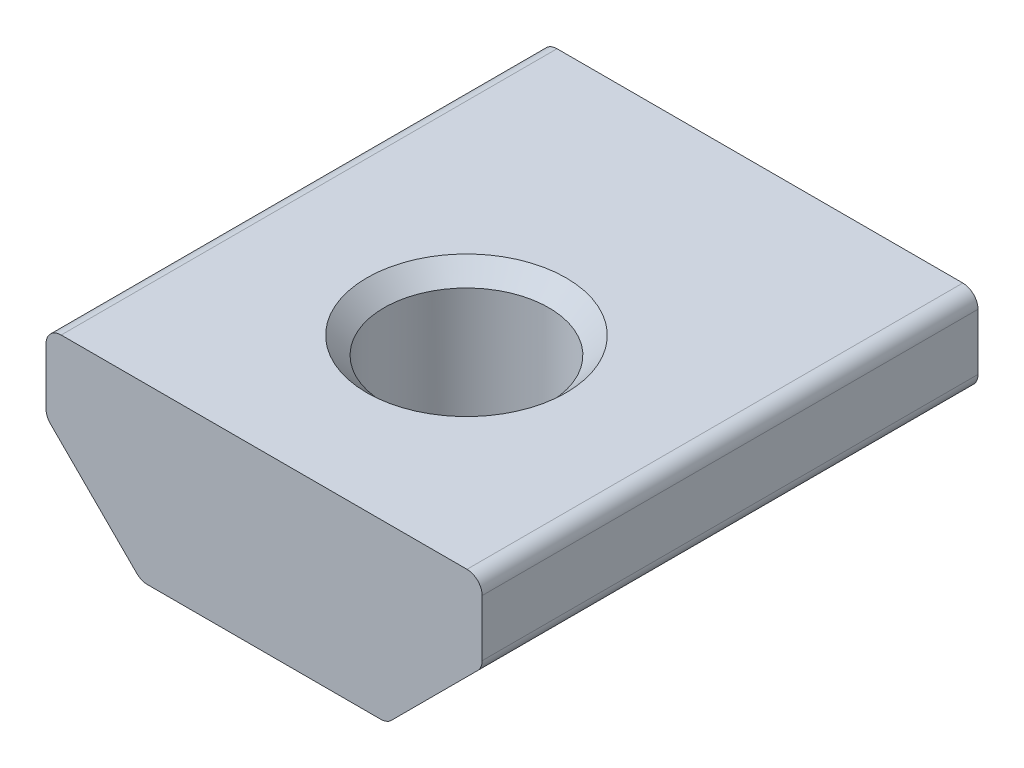
ISO-10303-21;
HEADER;
FILE_DESCRIPTION(('STEP AP214'),'2;1');
FILE_NAME('part.step','',(''),(''),'','','');
FILE_SCHEMA(('AUTOMOTIVE_DESIGN { 1 0 10303 214 1 1 1 1 }'));
ENDSEC;
DATA;
#1=APPLICATION_CONTEXT('core data for automotive mechanical design processes');
#2=APPLICATION_PROTOCOL_DEFINITION('international standard','automotive_design',2000,#1);
#3=PRODUCT_CONTEXT('',#1,'mechanical');
#4=PRODUCT('Part','Part','',(#3));
#5=PRODUCT_RELATED_PRODUCT_CATEGORY('part','',(#4));
#6=PRODUCT_DEFINITION_FORMATION('','',#4);
#7=PRODUCT_DEFINITION_CONTEXT('part definition',#1,'design');
#8=PRODUCT_DEFINITION('design','',#6,#7);
#9=PRODUCT_DEFINITION_SHAPE('','',#8);
#10=(LENGTH_UNIT() NAMED_UNIT(*) SI_UNIT(.MILLI.,.METRE.));
#11=(NAMED_UNIT(*) PLANE_ANGLE_UNIT() SI_UNIT($,.RADIAN.));
#12=(NAMED_UNIT(*) SI_UNIT($,.STERADIAN.) SOLID_ANGLE_UNIT());
#13=UNCERTAINTY_MEASURE_WITH_UNIT(LENGTH_MEASURE(1.E-05),#10,'distance_accuracy_value','');
#14=(GEOMETRIC_REPRESENTATION_CONTEXT(3) GLOBAL_UNCERTAINTY_ASSIGNED_CONTEXT((#13)) GLOBAL_UNIT_ASSIGNED_CONTEXT((#10,
#11,#12)) REPRESENTATION_CONTEXT('',''));
#15=CARTESIAN_POINT('',(0.,0.,0.));
#16=DIRECTION('',(0.,0.,1.));
#17=DIRECTION('',(1.,0.,0.));
#18=AXIS2_PLACEMENT_3D('',#15,#16,#17);
#19=CARTESIAN_POINT('',(5.4737,2.38887,-7.366));
#20=DIRECTION('',(1.,0.,0.));
#21=DIRECTION('',(0.,1.,0.));
#22=AXIS2_PLACEMENT_3D('',#19,#20,#21);
#23=PLANE('',#22);
#24=DIRECTION('',(0.,1.,0.));
#25=VECTOR('',#24,1.);
#26=CARTESIAN_POINT('',(5.4737,2.38887,-7.366));
#27=LINE('',#26,#25);
#28=CARTESIAN_POINT('',(5.4737,2.54668536726424,-7.366));
#29=VERTEX_POINT('',#28);
#30=CARTESIAN_POINT('',(5.4737,3.96239999999977,-7.366));
#31=VERTEX_POINT('',#30);
#32=EDGE_CURVE('E207',#29,#31,#27,.T.);
#33=ORIENTED_EDGE('',*,*,#32,.T.);
#34=DIRECTION('',(0.,0.,1.));
#35=VECTOR('',#34,1.);
#36=CARTESIAN_POINT('',(5.4737,3.96239999999977,-7.366));
#37=LINE('',#36,#35);
#38=CARTESIAN_POINT('',(5.4737,3.96239999999977,5.08));
#39=VERTEX_POINT('',#38);
#40=EDGE_CURVE('E189',#31,#39,#37,.T.);
#41=ORIENTED_EDGE('',*,*,#40,.T.);
#42=DIRECTION('',(0.,1.,0.));
#43=VECTOR('',#42,1.);
#44=CARTESIAN_POINT('',(5.4737,2.38887,5.08));
#45=LINE('',#44,#43);
#46=CARTESIAN_POINT('',(5.4737,2.54668536726424,5.08));
#47=VERTEX_POINT('',#46);
#48=EDGE_CURVE('E255',#47,#39,#45,.T.);
#49=ORIENTED_EDGE('',*,*,#48,.F.);
#50=DIRECTION('',(0.,0.,1.));
#51=VECTOR('',#50,1.);
#52=CARTESIAN_POINT('',(5.4737,2.54668536726424,-7.366));
#53=LINE('',#52,#51);
#54=EDGE_CURVE('E187',#47,#29,#53,.F.);
#55=ORIENTED_EDGE('',*,*,#54,.T.);
#56=EDGE_LOOP('',(#33,#41,#49,#55));
#57=FACE_BOUND('',#56,.T.);
#58=ADVANCED_FACE('F32',(#57),#23,.T.);
#59=CARTESIAN_POINT('',(3.08482999999997,0.,-7.366));
#60=DIRECTION('',(0.707106781186543,-0.707106781186552,0.));
#61=DIRECTION('',(0.707106781186552,0.707106781186543,0.));
#62=AXIS2_PLACEMENT_3D('',#59,#60,#61);
#63=PLANE('',#62);
#64=DIRECTION('',(0.707106781186552,0.707106781186543,0.));
#65=VECTOR('',#64,1.);
#66=CARTESIAN_POINT('',(3.08482999999997,0.,5.08));
#67=LINE('',#66,#65);
#68=CARTESIAN_POINT('',(3.19642231636797,0.11159231636799,5.08));
#69=VERTEX_POINT('',#68);
#70=CARTESIAN_POINT('',(5.36210768363201,2.277277683632,5.08));
#71=VERTEX_POINT('',#70);
#72=EDGE_CURVE('E198',#69,#71,#67,.T.);
#73=ORIENTED_EDGE('',*,*,#72,.F.);
#74=DIRECTION('',(0.,0.,1.));
#75=VECTOR('',#74,1.);
#76=CARTESIAN_POINT('',(3.19642231636797,0.11159231636799,-7.366));
#77=LINE('',#76,#75);
#78=CARTESIAN_POINT('',(3.19642231636797,0.11159231636799,-7.366));
#79=VERTEX_POINT('',#78);
#80=EDGE_CURVE('E11',#69,#79,#77,.F.);
#81=ORIENTED_EDGE('',*,*,#80,.T.);
#82=DIRECTION('',(0.707106781186552,0.707106781186543,0.));
#83=VECTOR('',#82,1.);
#84=CARTESIAN_POINT('',(3.08482999999997,0.,-7.366));
#85=LINE('',#84,#83);
#86=CARTESIAN_POINT('',(5.36210768363201,2.277277683632,-7.366));
#87=VERTEX_POINT('',#86);
#88=EDGE_CURVE('E201',#79,#87,#85,.T.);
#89=ORIENTED_EDGE('',*,*,#88,.T.);
#90=DIRECTION('',(0.,0.,1.));
#91=VECTOR('',#90,1.);
#92=CARTESIAN_POINT('',(5.36210768363201,2.277277683632,-7.366));
#93=LINE('',#92,#91);
#94=EDGE_CURVE('E40',#87,#71,#93,.T.);
#95=ORIENTED_EDGE('',*,*,#94,.T.);
#96=EDGE_LOOP('',(#73,#81,#89,#95));
#97=FACE_BOUND('',#96,.T.);
#98=ADVANCED_FACE('F197',(#97),#63,.T.);
#99=CARTESIAN_POINT('',(-3.08482999999997,0.,-7.366));
#100=DIRECTION('',(0.,-1.,0.));
#101=DIRECTION('',(1.,0.,0.));
#102=AXIS2_PLACEMENT_3D('',#99,#100,#101);
#103=PLANE('',#102);
#104=CARTESIAN_POINT('',(0.,0.,0.));
#105=DIRECTION('',(0.,-1.,0.));
#106=DIRECTION('',(1.,0.,0.));
#107=AXIS2_PLACEMENT_3D('',#104,#105,#106);
#108=CIRCLE('',#107,2.49999999999999);
#109=CARTESIAN_POINT('',(2.49999999999999,0.,0.));
#110=VERTEX_POINT('',#109);
#111=EDGE_CURVE('E214',#110,#110,#108,.F.);
#112=ORIENTED_EDGE('',*,*,#111,.T.);
#113=EDGE_LOOP('',(#112));
#114=FACE_BOUND('',#113,.T.);
#115=DIRECTION('',(1.,0.,0.));
#116=VECTOR('',#115,1.);
#117=CARTESIAN_POINT('',(-3.08482999999997,0.,5.08));
#118=LINE('',#117,#116);
#119=CARTESIAN_POINT('',(-2.92701463273573,0.,5.08));
#120=VERTEX_POINT('',#119);
#121=CARTESIAN_POINT('',(2.92701463273573,0.,5.08));
#122=VERTEX_POINT('',#121);
#123=EDGE_CURVE('E143',#120,#122,#118,.T.);
#124=ORIENTED_EDGE('',*,*,#123,.F.);
#125=DIRECTION('',(0.,0.,1.));
#126=VECTOR('',#125,1.);
#127=CARTESIAN_POINT('',(-2.92701463273573,0.,-7.366));
#128=LINE('',#127,#126);
#129=CARTESIAN_POINT('',(-2.92701463273573,0.,-7.366));
#130=VERTEX_POINT('',#129);
#131=EDGE_CURVE('E167',#120,#130,#128,.F.);
#132=ORIENTED_EDGE('',*,*,#131,.T.);
#133=DIRECTION('',(1.,0.,0.));
#134=VECTOR('',#133,1.);
#135=CARTESIAN_POINT('',(-3.08482999999997,0.,-7.366));
#136=LINE('',#135,#134);
#137=CARTESIAN_POINT('',(2.92701463273573,0.,-7.366));
#138=VERTEX_POINT('',#137);
#139=EDGE_CURVE('E246',#130,#138,#136,.T.);
#140=ORIENTED_EDGE('',*,*,#139,.T.);
#141=DIRECTION('',(0.,0.,1.));
#142=VECTOR('',#141,1.);
#143=CARTESIAN_POINT('',(2.92701463273573,0.,-7.366));
#144=LINE('',#143,#142);
#145=EDGE_CURVE('E164',#138,#122,#144,.T.);
#146=ORIENTED_EDGE('',*,*,#145,.T.);
#147=EDGE_LOOP('',(#124,#132,#140,#146));
#148=FACE_BOUND('',#147,.T.);
#149=ADVANCED_FACE('F232',(#114,#148),#103,.T.);
#150=CARTESIAN_POINT('',(-5.4737,2.38887,-7.366));
#151=DIRECTION('',(-0.707106781186544,-0.707106781186551,0.));
#152=DIRECTION('',(0.707106781186551,-0.707106781186544,0.));
#153=AXIS2_PLACEMENT_3D('',#150,#151,#152);
#154=PLANE('',#153);
#155=DIRECTION('',(0.707106781186551,-0.707106781186544,0.));
#156=VECTOR('',#155,1.);
#157=CARTESIAN_POINT('',(-5.4737,2.38887,-7.366));
#158=LINE('',#157,#156);
#159=CARTESIAN_POINT('',(-5.36210768363201,2.27727768363201,-7.366));
#160=VERTEX_POINT('',#159);
#161=CARTESIAN_POINT('',(-3.19642231636796,0.11159231636799,-7.366));
#162=VERTEX_POINT('',#161);
#163=EDGE_CURVE('E245',#160,#162,#158,.T.);
#164=ORIENTED_EDGE('',*,*,#163,.T.);
#165=DIRECTION('',(0.,0.,1.));
#166=VECTOR('',#165,1.);
#167=CARTESIAN_POINT('',(-3.19642231636796,0.111592316367991,-7.366));
#168=LINE('',#167,#166);
#169=CARTESIAN_POINT('',(-3.19642231636796,0.11159231636799,5.08));
#170=VERTEX_POINT('',#169);
#171=EDGE_CURVE('E142',#162,#170,#168,.T.);
#172=ORIENTED_EDGE('',*,*,#171,.T.);
#173=DIRECTION('',(0.707106781186551,-0.707106781186544,0.));
#174=VECTOR('',#173,1.);
#175=CARTESIAN_POINT('',(-5.4737,2.38887,5.08));
#176=LINE('',#175,#174);
#177=CARTESIAN_POINT('',(-5.36210768363201,2.27727768363201,5.08));
#178=VERTEX_POINT('',#177);
#179=EDGE_CURVE('E125',#178,#170,#176,.T.);
#180=ORIENTED_EDGE('',*,*,#179,.F.);
#181=DIRECTION('',(0.,0.,1.));
#182=VECTOR('',#181,1.);
#183=CARTESIAN_POINT('',(-5.36210768363201,2.27727768363201,-7.366));
#184=LINE('',#183,#182);
#185=EDGE_CURVE('E139',#178,#160,#184,.F.);
#186=ORIENTED_EDGE('',*,*,#185,.T.);
#187=EDGE_LOOP('',(#164,#172,#180,#186));
#188=FACE_BOUND('',#187,.T.);
#189=ADVANCED_FACE('F138',(#188),#154,.T.);
#190=CARTESIAN_POINT('',(-5.4737,4.3434,-7.366));
#191=DIRECTION('',(-1.,0.,0.));
#192=DIRECTION('',(0.,-1.,0.));
#193=AXIS2_PLACEMENT_3D('',#190,#191,#192);
#194=PLANE('',#193);
#195=DIRECTION('',(0.,-1.,0.));
#196=VECTOR('',#195,1.);
#197=CARTESIAN_POINT('',(-5.4737,4.3434,5.08));
#198=LINE('',#197,#196);
#199=CARTESIAN_POINT('',(-5.4737,3.96239999999977,5.08));
#200=VERTEX_POINT('',#199);
#201=CARTESIAN_POINT('',(-5.4737,2.54668536726425,5.08));
#202=VERTEX_POINT('',#201);
#203=EDGE_CURVE('E127',#200,#202,#198,.T.);
#204=ORIENTED_EDGE('',*,*,#203,.F.);
#205=DIRECTION('',(0.,0.,1.));
#206=VECTOR('',#205,1.);
#207=CARTESIAN_POINT('',(-5.4737,3.96239999999977,-7.366));
#208=LINE('',#207,#206);
#209=CARTESIAN_POINT('',(-5.4737,3.96239999999977,-7.366));
#210=VERTEX_POINT('',#209);
#211=EDGE_CURVE('E185',#200,#210,#208,.F.);
#212=ORIENTED_EDGE('',*,*,#211,.T.);
#213=DIRECTION('',(0.,-1.,0.));
#214=VECTOR('',#213,1.);
#215=CARTESIAN_POINT('',(-5.4737,4.3434,-7.366));
#216=LINE('',#215,#214);
#217=CARTESIAN_POINT('',(-5.4737,2.54668536726425,-7.366));
#218=VERTEX_POINT('',#217);
#219=EDGE_CURVE('E247',#210,#218,#216,.T.);
#220=ORIENTED_EDGE('',*,*,#219,.T.);
#221=DIRECTION('',(0.,0.,1.));
#222=VECTOR('',#221,1.);
#223=CARTESIAN_POINT('',(-5.4737,2.54668536726425,-7.366));
#224=LINE('',#223,#222);
#225=EDGE_CURVE('E183',#218,#202,#224,.T.);
#226=ORIENTED_EDGE('',*,*,#225,.T.);
#227=EDGE_LOOP('',(#204,#212,#220,#226));
#228=FACE_BOUND('',#227,.T.);
#229=ADVANCED_FACE('F367',(#228),#194,.T.);
#230=CARTESIAN_POINT('',(5.4737,4.3434,-7.366));
#231=DIRECTION('',(0.,1.,0.));
#232=DIRECTION('',(0.,0.,1.));
#233=AXIS2_PLACEMENT_3D('',#230,#231,#232);
#234=PLANE('',#233);
#235=CARTESIAN_POINT('',(0.,4.3434,0.));
#236=DIRECTION('',(0.,1.,0.));
#237=DIRECTION('',(0.,0.,1.));
#238=AXIS2_PLACEMENT_3D('',#235,#236,#237);
#239=CIRCLE('',#238,2.49999999999998);
#240=CARTESIAN_POINT('',(0.,4.3434,2.49999999999998));
#241=VERTEX_POINT('',#240);
#242=EDGE_CURVE('E148',#241,#241,#239,.F.);
#243=ORIENTED_EDGE('',*,*,#242,.T.);
#244=EDGE_LOOP('',(#243));
#245=FACE_BOUND('',#244,.T.);
#246=DIRECTION('',(-1.,0.,0.));
#247=VECTOR('',#246,1.);
#248=CARTESIAN_POINT('',(5.4737,4.3434,-7.366));
#249=LINE('',#248,#247);
#250=CARTESIAN_POINT('',(5.09269999999978,4.3434,-7.366));
#251=VERTEX_POINT('',#250);
#252=CARTESIAN_POINT('',(-5.09269999999977,4.3434,-7.366));
#253=VERTEX_POINT('',#252);
#254=EDGE_CURVE('E210',#251,#253,#249,.T.);
#255=ORIENTED_EDGE('',*,*,#254,.T.);
#256=DIRECTION('',(0.,0.,1.));
#257=VECTOR('',#256,1.);
#258=CARTESIAN_POINT('',(-5.09269999999977,4.3434,-7.366));
#259=LINE('',#258,#257);
#260=CARTESIAN_POINT('',(-5.09269999999977,4.3434,5.08));
#261=VERTEX_POINT('',#260);
#262=EDGE_CURVE('E180',#253,#261,#259,.T.);
#263=ORIENTED_EDGE('',*,*,#262,.T.);
#264=DIRECTION('',(-1.,0.,0.));
#265=VECTOR('',#264,1.);
#266=CARTESIAN_POINT('',(5.4737,4.3434,5.08));
#267=LINE('',#266,#265);
#268=CARTESIAN_POINT('',(5.09269999999978,4.3434,5.08));
#269=VERTEX_POINT('',#268);
#270=EDGE_CURVE('E257',#269,#261,#267,.T.);
#271=ORIENTED_EDGE('',*,*,#270,.F.);
#272=DIRECTION('',(0.,0.,1.));
#273=VECTOR('',#272,1.);
#274=CARTESIAN_POINT('',(5.09269999999978,4.3434,-7.366));
#275=LINE('',#274,#273);
#276=EDGE_CURVE('E54',#269,#251,#275,.F.);
#277=ORIENTED_EDGE('',*,*,#276,.T.);
#278=EDGE_LOOP('',(#255,#263,#271,#277));
#279=FACE_BOUND('',#278,.T.);
#280=ADVANCED_FACE('F260',(#245,#279),#234,.T.);
#281=CARTESIAN_POINT('',(0.,0.,-7.366));
#282=DIRECTION('',(0.,0.,1.));
#283=DIRECTION('',(1.,0.,0.));
#284=AXIS2_PLACEMENT_3D('',#281,#282,#283);
#285=PLANE('',#284);
#286=ORIENTED_EDGE('',*,*,#139,.F.);
#287=CARTESIAN_POINT('',(-2.92701463273573,0.381000000000227,-7.366));
#288=DIRECTION('',(0.,0.,1.));
#289=DIRECTION('',(1.,0.,0.));
#290=AXIS2_PLACEMENT_3D('',#287,#288,#289);
#291=CIRCLE('',#290,0.381000000000226);
#292=EDGE_CURVE('E177',#130,#162,#291,.F.);
#293=ORIENTED_EDGE('',*,*,#292,.T.);
#294=ORIENTED_EDGE('',*,*,#163,.F.);
#295=CARTESIAN_POINT('',(-5.09269999999977,2.54668536726425,-7.366));
#296=DIRECTION('',(0.,0.,1.));
#297=DIRECTION('',(1.,0.,0.));
#298=AXIS2_PLACEMENT_3D('',#295,#296,#297);
#299=CIRCLE('',#298,0.381000000000226);
#300=EDGE_CURVE('E147',#160,#218,#299,.F.);
#301=ORIENTED_EDGE('',*,*,#300,.T.);
#302=ORIENTED_EDGE('',*,*,#219,.F.);
#303=CARTESIAN_POINT('',(-5.09269999999977,3.96239999999977,-7.366));
#304=DIRECTION('',(0.,0.,1.));
#305=DIRECTION('',(1.,0.,0.));
#306=AXIS2_PLACEMENT_3D('',#303,#304,#305);
#307=CIRCLE('',#306,0.381000000000226);
#308=EDGE_CURVE('E47',#210,#253,#307,.F.);
#309=ORIENTED_EDGE('',*,*,#308,.T.);
#310=ORIENTED_EDGE('',*,*,#254,.F.);
#311=CARTESIAN_POINT('',(5.09269999999978,3.96239999999977,-7.366));
#312=DIRECTION('',(0.,0.,1.));
#313=DIRECTION('',(1.,0.,0.));
#314=AXIS2_PLACEMENT_3D('',#311,#312,#313);
#315=CIRCLE('',#314,0.381000000000226);
#316=EDGE_CURVE('E173',#251,#31,#315,.F.);
#317=ORIENTED_EDGE('',*,*,#316,.T.);
#318=ORIENTED_EDGE('',*,*,#32,.F.);
#319=CARTESIAN_POINT('',(5.09269999999977,2.54668536726424,-7.366));
#320=DIRECTION('',(0.,0.,1.));
#321=DIRECTION('',(1.,0.,0.));
#322=AXIS2_PLACEMENT_3D('',#319,#320,#321);
#323=CIRCLE('',#322,0.381000000000226);
#324=EDGE_CURVE('E169',#29,#87,#323,.F.);
#325=ORIENTED_EDGE('',*,*,#324,.T.);
#326=ORIENTED_EDGE('',*,*,#88,.F.);
#327=CARTESIAN_POINT('',(2.92701463273573,0.381000000000226,-7.366));
#328=DIRECTION('',(0.,0.,1.));
#329=DIRECTION('',(1.,0.,0.));
#330=AXIS2_PLACEMENT_3D('',#327,#328,#329);
#331=CIRCLE('',#330,0.381000000000226);
#332=EDGE_CURVE('E171',#79,#138,#331,.F.);
#333=ORIENTED_EDGE('',*,*,#332,.T.);
#334=EDGE_LOOP('',(#286,#293,#294,#301,#302,#309,#310,#317,#318,#325,#326,#333));
#335=FACE_BOUND('',#334,.T.);
#336=ADVANCED_FACE('F244',(#335),#285,.F.);
#337=CARTESIAN_POINT('',(0.,0.,5.08));
#338=DIRECTION('',(0.,0.,1.));
#339=DIRECTION('',(1.,0.,0.));
#340=AXIS2_PLACEMENT_3D('',#337,#338,#339);
#341=PLANE('',#340);
#342=ORIENTED_EDGE('',*,*,#179,.T.);
#343=CARTESIAN_POINT('',(-2.92701463273573,0.381000000000227,5.08));
#344=DIRECTION('',(0.,0.,1.));
#345=DIRECTION('',(1.,0.,0.));
#346=AXIS2_PLACEMENT_3D('',#343,#344,#345);
#347=CIRCLE('',#346,0.381000000000226);
#348=EDGE_CURVE('E162',#170,#120,#347,.T.);
#349=ORIENTED_EDGE('',*,*,#348,.T.);
#350=ORIENTED_EDGE('',*,*,#123,.T.);
#351=CARTESIAN_POINT('',(2.92701463273573,0.381000000000226,5.08));
#352=DIRECTION('',(0.,0.,1.));
#353=DIRECTION('',(1.,0.,0.));
#354=AXIS2_PLACEMENT_3D('',#351,#352,#353);
#355=CIRCLE('',#354,0.381000000000226);
#356=EDGE_CURVE('E158',#122,#69,#355,.T.);
#357=ORIENTED_EDGE('',*,*,#356,.T.);
#358=ORIENTED_EDGE('',*,*,#72,.T.);
#359=CARTESIAN_POINT('',(5.09269999999977,2.54668536726424,5.08));
#360=DIRECTION('',(0.,0.,1.));
#361=DIRECTION('',(1.,0.,0.));
#362=AXIS2_PLACEMENT_3D('',#359,#360,#361);
#363=CIRCLE('',#362,0.381000000000226);
#364=EDGE_CURVE('E150',#71,#47,#363,.T.);
#365=ORIENTED_EDGE('',*,*,#364,.T.);
#366=ORIENTED_EDGE('',*,*,#48,.T.);
#367=CARTESIAN_POINT('',(5.09269999999978,3.96239999999977,5.08));
#368=DIRECTION('',(0.,0.,1.));
#369=DIRECTION('',(1.,0.,0.));
#370=AXIS2_PLACEMENT_3D('',#367,#368,#369);
#371=CIRCLE('',#370,0.381000000000226);
#372=EDGE_CURVE('E133',#39,#269,#371,.T.);
#373=ORIENTED_EDGE('',*,*,#372,.T.);
#374=ORIENTED_EDGE('',*,*,#270,.T.);
#375=CARTESIAN_POINT('',(-5.09269999999977,3.96239999999977,5.08));
#376=DIRECTION('',(0.,0.,1.));
#377=DIRECTION('',(1.,0.,0.));
#378=AXIS2_PLACEMENT_3D('',#375,#376,#377);
#379=CIRCLE('',#378,0.381000000000226);
#380=EDGE_CURVE('E132',#261,#200,#379,.T.);
#381=ORIENTED_EDGE('',*,*,#380,.T.);
#382=ORIENTED_EDGE('',*,*,#203,.T.);
#383=CARTESIAN_POINT('',(-5.09269999999977,2.54668536726425,5.08));
#384=DIRECTION('',(0.,0.,1.));
#385=DIRECTION('',(1.,0.,0.));
#386=AXIS2_PLACEMENT_3D('',#383,#384,#385);
#387=CIRCLE('',#386,0.381000000000226);
#388=EDGE_CURVE('E122',#202,#178,#387,.T.);
#389=ORIENTED_EDGE('',*,*,#388,.T.);
#390=EDGE_LOOP('',(#342,#349,#350,#357,#358,#365,#366,#373,#374,#381,#382,#389));
#391=FACE_BOUND('',#390,.T.);
#392=ADVANCED_FACE('F124',(#391),#341,.T.);
#393=CARTESIAN_POINT('',(0.,4.3434,0.));
#394=DIRECTION('',(0.,1.,0.));
#395=DIRECTION('',(0.,0.,1.));
#396=AXIS2_PLACEMENT_3D('',#393,#394,#395);
#397=CYLINDRICAL_SURFACE('',#396,2.06699999999999);
#398=CARTESIAN_POINT('',(0.,0.433000000000005,0.));
#399=DIRECTION('',(0.,-1.,0.));
#400=DIRECTION('',(0.,0.,-1.));
#401=AXIS2_PLACEMENT_3D('',#398,#399,#400);
#402=CIRCLE('',#401,2.06699999999999);
#403=CARTESIAN_POINT('',(0.,0.433000000000005,-2.06699999999999));
#404=VERTEX_POINT('',#403);
#405=EDGE_CURVE('E153',#404,#404,#402,.T.);
#406=ORIENTED_EDGE('',*,*,#405,.T.);
#407=EDGE_LOOP('',(#406));
#408=FACE_BOUND('',#407,.T.);
#409=CARTESIAN_POINT('',(0.,3.91040000000001,0.));
#410=DIRECTION('',(0.,1.,0.));
#411=DIRECTION('',(0.,0.,1.));
#412=AXIS2_PLACEMENT_3D('',#409,#410,#411);
#413=CIRCLE('',#412,2.06699999999999);
#414=CARTESIAN_POINT('',(0.,3.91040000000001,2.06699999999999));
#415=VERTEX_POINT('',#414);
#416=EDGE_CURVE('E217',#415,#415,#413,.T.);
#417=ORIENTED_EDGE('',*,*,#416,.T.);
#418=EDGE_LOOP('',(#417));
#419=FACE_BOUND('',#418,.T.);
#420=ADVANCED_FACE('F222',(#408,#419),#397,.F.);
#421=CARTESIAN_POINT('',(0.,0.,0.));
#422=DIRECTION('',(0.,-1.,0.));
#423=DIRECTION('',(0.,0.,-1.));
#424=AXIS2_PLACEMENT_3D('',#421,#422,#423);
#425=CONICAL_SURFACE('',#424,2.49999999999999,0.785398163397446);
#426=ORIENTED_EDGE('',*,*,#405,.F.);
#427=EDGE_LOOP('',(#426));
#428=FACE_BOUND('',#427,.T.);
#429=ORIENTED_EDGE('',*,*,#111,.F.);
#430=EDGE_LOOP('',(#429));
#431=FACE_BOUND('',#430,.T.);
#432=ADVANCED_FACE('F225',(#428,#431),#425,.F.);
#433=CARTESIAN_POINT('',(0.,3.91040000000001,0.));
#434=DIRECTION('',(0.,1.,0.));
#435=DIRECTION('',(0.,0.,1.));
#436=AXIS2_PLACEMENT_3D('',#433,#434,#435);
#437=CONICAL_SURFACE('',#436,2.06699999999999,0.785398163397453);
#438=ORIENTED_EDGE('',*,*,#242,.F.);
#439=EDGE_LOOP('',(#438));
#440=FACE_BOUND('',#439,.T.);
#441=ORIENTED_EDGE('',*,*,#416,.F.);
#442=EDGE_LOOP('',(#441));
#443=FACE_BOUND('',#442,.T.);
#444=ADVANCED_FACE('F228',(#440,#443),#437,.F.);
#445=CARTESIAN_POINT('',(-2.92701463273573,0.381000000000227,-7.366));
#446=DIRECTION('',(0.,0.,1.));
#447=DIRECTION('',(1.,0.,0.));
#448=AXIS2_PLACEMENT_3D('',#445,#446,#447);
#449=CYLINDRICAL_SURFACE('',#448,0.381000000000226);
#450=ORIENTED_EDGE('',*,*,#292,.F.);
#451=ORIENTED_EDGE('',*,*,#131,.F.);
#452=ORIENTED_EDGE('',*,*,#348,.F.);
#453=ORIENTED_EDGE('',*,*,#171,.F.);
#454=EDGE_LOOP('',(#450,#451,#452,#453));
#455=FACE_BOUND('',#454,.T.);
#456=ADVANCED_FACE('F243',(#455),#449,.T.);
#457=CARTESIAN_POINT('',(-5.09269999999977,3.96239999999977,-7.366));
#458=DIRECTION('',(0.,0.,1.));
#459=DIRECTION('',(1.,0.,0.));
#460=AXIS2_PLACEMENT_3D('',#457,#458,#459);
#461=CYLINDRICAL_SURFACE('',#460,0.381000000000226);
#462=ORIENTED_EDGE('',*,*,#308,.F.);
#463=ORIENTED_EDGE('',*,*,#211,.F.);
#464=ORIENTED_EDGE('',*,*,#380,.F.);
#465=ORIENTED_EDGE('',*,*,#262,.F.);
#466=EDGE_LOOP('',(#462,#463,#464,#465));
#467=FACE_BOUND('',#466,.T.);
#468=ADVANCED_FACE('F292',(#467),#461,.T.);
#469=CARTESIAN_POINT('',(-5.09269999999977,2.54668536726425,-7.366));
#470=DIRECTION('',(0.,0.,1.));
#471=DIRECTION('',(1.,0.,0.));
#472=AXIS2_PLACEMENT_3D('',#469,#470,#471);
#473=CYLINDRICAL_SURFACE('',#472,0.381000000000226);
#474=ORIENTED_EDGE('',*,*,#300,.F.);
#475=ORIENTED_EDGE('',*,*,#185,.F.);
#476=ORIENTED_EDGE('',*,*,#388,.F.);
#477=ORIENTED_EDGE('',*,*,#225,.F.);
#478=EDGE_LOOP('',(#474,#475,#476,#477));
#479=FACE_BOUND('',#478,.T.);
#480=ADVANCED_FACE('F146',(#479),#473,.T.);
#481=CARTESIAN_POINT('',(5.09269999999978,3.96239999999977,-7.366));
#482=DIRECTION('',(0.,0.,1.));
#483=DIRECTION('',(1.,0.,0.));
#484=AXIS2_PLACEMENT_3D('',#481,#482,#483);
#485=CYLINDRICAL_SURFACE('',#484,0.381000000000226);
#486=ORIENTED_EDGE('',*,*,#316,.F.);
#487=ORIENTED_EDGE('',*,*,#276,.F.);
#488=ORIENTED_EDGE('',*,*,#372,.F.);
#489=ORIENTED_EDGE('',*,*,#40,.F.);
#490=EDGE_LOOP('',(#486,#487,#488,#489));
#491=FACE_BOUND('',#490,.T.);
#492=ADVANCED_FACE('F264',(#491),#485,.T.);
#493=CARTESIAN_POINT('',(2.92701463273573,0.381000000000226,-7.366));
#494=DIRECTION('',(0.,0.,1.));
#495=DIRECTION('',(1.,0.,0.));
#496=AXIS2_PLACEMENT_3D('',#493,#494,#495);
#497=CYLINDRICAL_SURFACE('',#496,0.381000000000226);
#498=ORIENTED_EDGE('',*,*,#332,.F.);
#499=ORIENTED_EDGE('',*,*,#80,.F.);
#500=ORIENTED_EDGE('',*,*,#356,.F.);
#501=ORIENTED_EDGE('',*,*,#145,.F.);
#502=EDGE_LOOP('',(#498,#499,#500,#501));
#503=FACE_BOUND('',#502,.T.);
#504=ADVANCED_FACE('F271',(#503),#497,.T.);
#505=CARTESIAN_POINT('',(5.09269999999977,2.54668536726424,-7.366));
#506=DIRECTION('',(0.,0.,1.));
#507=DIRECTION('',(1.,0.,0.));
#508=AXIS2_PLACEMENT_3D('',#505,#506,#507);
#509=CYLINDRICAL_SURFACE('',#508,0.381000000000226);
#510=ORIENTED_EDGE('',*,*,#324,.F.);
#511=ORIENTED_EDGE('',*,*,#54,.F.);
#512=ORIENTED_EDGE('',*,*,#364,.F.);
#513=ORIENTED_EDGE('',*,*,#94,.F.);
#514=EDGE_LOOP('',(#510,#511,#512,#513));
#515=FACE_BOUND('',#514,.T.);
#516=ADVANCED_FACE('F34',(#515),#509,.T.);
#517=CLOSED_SHELL('',(#58,#98,#149,#189,#229,#280,#336,#392,#420,#432,#444,#456,#468,#480,#492,
#504,#516));
#518=MANIFOLD_SOLID_BREP('B2',#517);
#519=ADVANCED_BREP_SHAPE_REPRESENTATION('',(#18,#518),#14);
#520=SHAPE_DEFINITION_REPRESENTATION(#9,#519);
ENDSEC;
END-ISO-10303-21;
